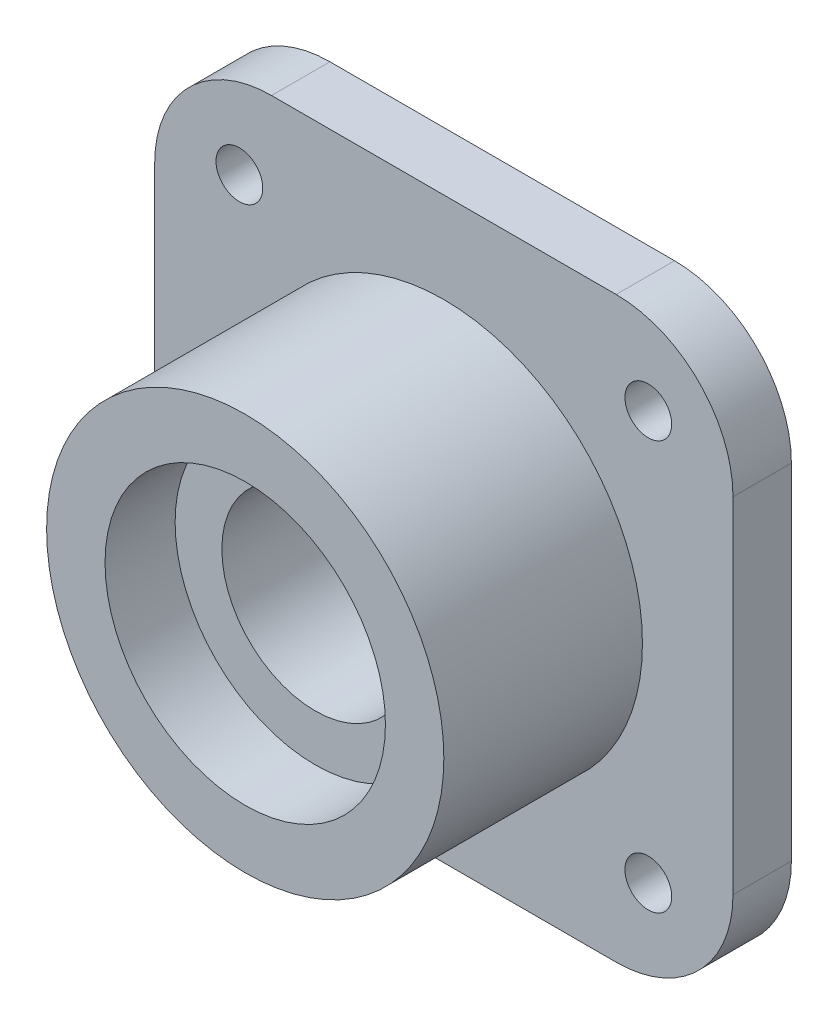
ISO-10303-21;
HEADER;
FILE_DESCRIPTION(('STEP AP214'),'2;1');
FILE_NAME('part.step','',(''),(''),'','','');
FILE_SCHEMA(('AUTOMOTIVE_DESIGN { 1 0 10303 214 1 1 1 1 }'));
ENDSEC;
DATA;
#1=APPLICATION_CONTEXT('core data for automotive mechanical design processes');
#2=APPLICATION_PROTOCOL_DEFINITION('international standard','automotive_design',2000,#1);
#3=PRODUCT_CONTEXT('',#1,'mechanical');
#4=PRODUCT('Part','Part','',(#3));
#5=PRODUCT_RELATED_PRODUCT_CATEGORY('part','',(#4));
#6=PRODUCT_DEFINITION_FORMATION('','',#4);
#7=PRODUCT_DEFINITION_CONTEXT('part definition',#1,'design');
#8=PRODUCT_DEFINITION('design','',#6,#7);
#9=PRODUCT_DEFINITION_SHAPE('','',#8);
#10=(LENGTH_UNIT() NAMED_UNIT(*) SI_UNIT(.MILLI.,.METRE.));
#11=(NAMED_UNIT(*) PLANE_ANGLE_UNIT() SI_UNIT($,.RADIAN.));
#12=(NAMED_UNIT(*) SI_UNIT($,.STERADIAN.) SOLID_ANGLE_UNIT());
#13=UNCERTAINTY_MEASURE_WITH_UNIT(LENGTH_MEASURE(1.E-05),#10,'distance_accuracy_value','');
#14=(GEOMETRIC_REPRESENTATION_CONTEXT(3) GLOBAL_UNCERTAINTY_ASSIGNED_CONTEXT((#13)) GLOBAL_UNIT_ASSIGNED_CONTEXT((#10,
#11,#12)) REPRESENTATION_CONTEXT('',''));
#15=CARTESIAN_POINT('',(0.,0.,0.));
#16=DIRECTION('',(0.,0.,1.));
#17=DIRECTION('',(1.,0.,0.));
#18=AXIS2_PLACEMENT_3D('',#15,#16,#17);
#19=CARTESIAN_POINT('',(0.,12.,-22.));
#20=DIRECTION('',(0.,0.,1.));
#21=DIRECTION('',(1.,0.,0.));
#22=AXIS2_PLACEMENT_3D('',#19,#20,#21);
#23=PLANE('',#22);
#24=CARTESIAN_POINT('',(17.5,-17.5,-22.));
#25=DIRECTION('',(0.,0.,-1.));
#26=DIRECTION('',(-1.,0.,0.));
#27=AXIS2_PLACEMENT_3D('',#24,#25,#26);
#28=CIRCLE('',#27,2.);
#29=CARTESIAN_POINT('',(15.5,-17.5,-22.));
#30=VERTEX_POINT('',#29);
#31=EDGE_CURVE('E323',#30,#30,#28,.T.);
#32=ORIENTED_EDGE('',*,*,#31,.F.);
#33=EDGE_LOOP('',(#32));
#34=FACE_BOUND('',#33,.T.);
#35=CARTESIAN_POINT('',(-17.5,-17.5,-22.));
#36=DIRECTION('',(0.,0.,-1.));
#37=DIRECTION('',(-1.,0.,0.));
#38=AXIS2_PLACEMENT_3D('',#35,#36,#37);
#39=CIRCLE('',#38,2.);
#40=CARTESIAN_POINT('',(-19.5,-17.5,-22.));
#41=VERTEX_POINT('',#40);
#42=EDGE_CURVE('E319',#41,#41,#39,.T.);
#43=ORIENTED_EDGE('',*,*,#42,.F.);
#44=EDGE_LOOP('',(#43));
#45=FACE_BOUND('',#44,.T.);
#46=CARTESIAN_POINT('',(-17.5,17.5,-22.));
#47=DIRECTION('',(0.,0.,-1.));
#48=DIRECTION('',(-1.,0.,0.));
#49=AXIS2_PLACEMENT_3D('',#46,#47,#48);
#50=CIRCLE('',#49,2.);
#51=CARTESIAN_POINT('',(-19.5,17.5,-22.));
#52=VERTEX_POINT('',#51);
#53=EDGE_CURVE('E312',#52,#52,#50,.T.);
#54=ORIENTED_EDGE('',*,*,#53,.F.);
#55=EDGE_LOOP('',(#54));
#56=FACE_BOUND('',#55,.T.);
#57=CARTESIAN_POINT('',(17.5,17.5,-22.));
#58=DIRECTION('',(0.,0.,-1.));
#59=DIRECTION('',(-1.,0.,0.));
#60=AXIS2_PLACEMENT_3D('',#57,#58,#59);
#61=CIRCLE('',#60,2.);
#62=CARTESIAN_POINT('',(15.5,17.5,-22.));
#63=VERTEX_POINT('',#62);
#64=EDGE_CURVE('E193',#63,#63,#61,.T.);
#65=ORIENTED_EDGE('',*,*,#64,.F.);
#66=EDGE_LOOP('',(#65));
#67=FACE_BOUND('',#66,.T.);
#68=CARTESIAN_POINT('',(0.,0.,-22.));
#69=DIRECTION('',(0.,0.,1.));
#70=DIRECTION('',(1.,0.,0.));
#71=AXIS2_PLACEMENT_3D('',#68,#69,#70);
#72=CIRCLE('',#71,12.);
#73=CARTESIAN_POINT('',(12.,0.,-22.));
#74=VERTEX_POINT('',#73);
#75=EDGE_CURVE('E150',#74,#74,#72,.T.);
#76=ORIENTED_EDGE('',*,*,#75,.T.);
#77=EDGE_LOOP('',(#76));
#78=FACE_BOUND('',#77,.T.);
#79=DIRECTION('',(1.,0.,0.));
#80=VECTOR('',#79,1.);
#81=CARTESIAN_POINT('',(0.,24.7487373415292,-22.));
#82=LINE('',#81,#80);
#83=CARTESIAN_POINT('',(-14.7487373415292,24.7487373415292,-22.));
#84=VERTEX_POINT('',#83);
#85=CARTESIAN_POINT('',(14.7487373415292,24.7487373415292,-22.));
#86=VERTEX_POINT('',#85);
#87=EDGE_CURVE('E138',#84,#86,#82,.T.);
#88=ORIENTED_EDGE('',*,*,#87,.T.);
#89=CARTESIAN_POINT('',(14.7487373415292,14.7487373415292,-22.));
#90=DIRECTION('',(0.,0.,1.));
#91=DIRECTION('',(1.,0.,0.));
#92=AXIS2_PLACEMENT_3D('',#89,#90,#91);
#93=CIRCLE('',#92,10.);
#94=CARTESIAN_POINT('',(24.7487373415292,14.7487373415292,-22.));
#95=VERTEX_POINT('',#94);
#96=EDGE_CURVE('E181',#86,#95,#93,.F.);
#97=ORIENTED_EDGE('',*,*,#96,.T.);
#98=DIRECTION('',(0.,-1.,0.));
#99=VECTOR('',#98,1.);
#100=CARTESIAN_POINT('',(24.7487373415292,12.,-22.));
#101=LINE('',#100,#99);
#102=CARTESIAN_POINT('',(24.7487373415292,-14.7487373415292,-22.));
#103=VERTEX_POINT('',#102);
#104=EDGE_CURVE('E127',#95,#103,#101,.T.);
#105=ORIENTED_EDGE('',*,*,#104,.T.);
#106=CARTESIAN_POINT('',(14.7487373415292,-14.7487373415292,-22.));
#107=DIRECTION('',(0.,0.,1.));
#108=DIRECTION('',(1.,0.,0.));
#109=AXIS2_PLACEMENT_3D('',#106,#107,#108);
#110=CIRCLE('',#109,10.);
#111=CARTESIAN_POINT('',(14.7487373415292,-24.7487373415292,-22.));
#112=VERTEX_POINT('',#111);
#113=EDGE_CURVE('E179',#103,#112,#110,.F.);
#114=ORIENTED_EDGE('',*,*,#113,.T.);
#115=DIRECTION('',(1.,0.,0.));
#116=VECTOR('',#115,1.);
#117=CARTESIAN_POINT('',(0.,-24.7487373415292,-22.));
#118=LINE('',#117,#116);
#119=CARTESIAN_POINT('',(-14.7487373415292,-24.7487373415292,-22.));
#120=VERTEX_POINT('',#119);
#121=EDGE_CURVE('E203',#120,#112,#118,.T.);
#122=ORIENTED_EDGE('',*,*,#121,.F.);
#123=CARTESIAN_POINT('',(-14.7487373415292,-14.7487373415292,-22.));
#124=DIRECTION('',(0.,0.,1.));
#125=DIRECTION('',(1.,0.,0.));
#126=AXIS2_PLACEMENT_3D('',#123,#124,#125);
#127=CIRCLE('',#126,10.);
#128=CARTESIAN_POINT('',(-24.7487373415292,-14.7487373415292,-22.));
#129=VERTEX_POINT('',#128);
#130=EDGE_CURVE('E56',#120,#129,#127,.F.);
#131=ORIENTED_EDGE('',*,*,#130,.T.);
#132=DIRECTION('',(0.,-1.,0.));
#133=VECTOR('',#132,1.);
#134=CARTESIAN_POINT('',(-24.7487373415292,12.,-22.));
#135=LINE('',#134,#133);
#136=CARTESIAN_POINT('',(-24.7487373415292,14.7487373415292,-22.));
#137=VERTEX_POINT('',#136);
#138=EDGE_CURVE('E133',#137,#129,#135,.T.);
#139=ORIENTED_EDGE('',*,*,#138,.F.);
#140=CARTESIAN_POINT('',(-14.7487373415292,14.7487373415292,-22.));
#141=DIRECTION('',(0.,0.,1.));
#142=DIRECTION('',(1.,0.,0.));
#143=AXIS2_PLACEMENT_3D('',#140,#141,#142);
#144=CIRCLE('',#143,10.);
#145=EDGE_CURVE('E176',#137,#84,#144,.F.);
#146=ORIENTED_EDGE('',*,*,#145,.T.);
#147=EDGE_LOOP('',(#88,#97,#105,#114,#122,#131,#139,#146));
#148=FACE_BOUND('',#147,.T.);
#149=ADVANCED_FACE('F39',(#34,#45,#56,#67,#78,#148),#23,.F.);
#150=CARTESIAN_POINT('',(0.,35.,-17.));
#151=DIRECTION('',(0.,0.,-1.));
#152=DIRECTION('',(-1.,0.,0.));
#153=AXIS2_PLACEMENT_3D('',#150,#151,#152);
#154=PLANE('',#153);
#155=CARTESIAN_POINT('',(17.5,-17.5,-17.));
#156=DIRECTION('',(0.,0.,-1.));
#157=DIRECTION('',(-1.,0.,0.));
#158=AXIS2_PLACEMENT_3D('',#155,#156,#157);
#159=CIRCLE('',#158,2.);
#160=CARTESIAN_POINT('',(15.5,-17.5,-17.));
#161=VERTEX_POINT('',#160);
#162=EDGE_CURVE('E43',#161,#161,#159,.T.);
#163=ORIENTED_EDGE('',*,*,#162,.T.);
#164=EDGE_LOOP('',(#163));
#165=FACE_BOUND('',#164,.T.);
#166=CARTESIAN_POINT('',(-17.5,-17.5,-17.));
#167=DIRECTION('',(0.,0.,-1.));
#168=DIRECTION('',(-1.,0.,0.));
#169=AXIS2_PLACEMENT_3D('',#166,#167,#168);
#170=CIRCLE('',#169,2.);
#171=CARTESIAN_POINT('',(-19.5,-17.5,-17.));
#172=VERTEX_POINT('',#171);
#173=EDGE_CURVE('E195',#172,#172,#170,.T.);
#174=ORIENTED_EDGE('',*,*,#173,.T.);
#175=EDGE_LOOP('',(#174));
#176=FACE_BOUND('',#175,.T.);
#177=CARTESIAN_POINT('',(-17.5,17.5,-17.));
#178=DIRECTION('',(0.,0.,-1.));
#179=DIRECTION('',(-1.,0.,0.));
#180=AXIS2_PLACEMENT_3D('',#177,#178,#179);
#181=CIRCLE('',#180,2.);
#182=CARTESIAN_POINT('',(-19.5,17.5,-17.));
#183=VERTEX_POINT('',#182);
#184=EDGE_CURVE('E192',#183,#183,#181,.T.);
#185=ORIENTED_EDGE('',*,*,#184,.T.);
#186=EDGE_LOOP('',(#185));
#187=FACE_BOUND('',#186,.T.);
#188=CARTESIAN_POINT('',(17.5,17.5,-17.));
#189=DIRECTION('',(0.,0.,-1.));
#190=DIRECTION('',(-1.,0.,0.));
#191=AXIS2_PLACEMENT_3D('',#188,#189,#190);
#192=CIRCLE('',#191,2.);
#193=CARTESIAN_POINT('',(15.5,17.5,-17.));
#194=VERTEX_POINT('',#193);
#195=EDGE_CURVE('E189',#194,#194,#192,.T.);
#196=ORIENTED_EDGE('',*,*,#195,.T.);
#197=EDGE_LOOP('',(#196));
#198=FACE_BOUND('',#197,.T.);
#199=CARTESIAN_POINT('',(0.,0.,-17.));
#200=DIRECTION('',(0.,0.,1.));
#201=DIRECTION('',(1.,0.,0.));
#202=AXIS2_PLACEMENT_3D('',#199,#200,#201);
#203=CIRCLE('',#202,17.);
#204=CARTESIAN_POINT('',(17.,0.,-17.));
#205=VERTEX_POINT('',#204);
#206=EDGE_CURVE('E147',#205,#205,#203,.T.);
#207=ORIENTED_EDGE('',*,*,#206,.F.);
#208=EDGE_LOOP('',(#207));
#209=FACE_BOUND('',#208,.T.);
#210=DIRECTION('',(0.,-1.,0.));
#211=VECTOR('',#210,1.);
#212=CARTESIAN_POINT('',(24.7487373415292,0.,-17.));
#213=LINE('',#212,#211);
#214=CARTESIAN_POINT('',(24.7487373415292,14.7487373415292,-17.));
#215=VERTEX_POINT('',#214);
#216=CARTESIAN_POINT('',(24.7487373415292,-14.7487373415292,-17.));
#217=VERTEX_POINT('',#216);
#218=EDGE_CURVE('E124',#215,#217,#213,.T.);
#219=ORIENTED_EDGE('',*,*,#218,.F.);
#220=CARTESIAN_POINT('',(14.7487373415292,14.7487373415292,-17.));
#221=DIRECTION('',(0.,0.,-1.));
#222=DIRECTION('',(-1.,0.,0.));
#223=AXIS2_PLACEMENT_3D('',#220,#221,#222);
#224=CIRCLE('',#223,10.);
#225=CARTESIAN_POINT('',(14.7487373415292,24.7487373415292,-17.));
#226=VERTEX_POINT('',#225);
#227=EDGE_CURVE('E107',#215,#226,#224,.F.);
#228=ORIENTED_EDGE('',*,*,#227,.T.);
#229=DIRECTION('',(1.,0.,0.));
#230=VECTOR('',#229,1.);
#231=CARTESIAN_POINT('',(0.,24.7487373415292,-17.));
#232=LINE('',#231,#230);
#233=CARTESIAN_POINT('',(-14.7487373415292,24.7487373415292,-17.));
#234=VERTEX_POINT('',#233);
#235=EDGE_CURVE('E207',#234,#226,#232,.T.);
#236=ORIENTED_EDGE('',*,*,#235,.F.);
#237=CARTESIAN_POINT('',(-14.7487373415292,14.7487373415292,-17.));
#238=DIRECTION('',(0.,0.,-1.));
#239=DIRECTION('',(-1.,0.,0.));
#240=AXIS2_PLACEMENT_3D('',#237,#238,#239);
#241=CIRCLE('',#240,10.);
#242=CARTESIAN_POINT('',(-24.7487373415292,14.7487373415292,-17.));
#243=VERTEX_POINT('',#242);
#244=EDGE_CURVE('E128',#234,#243,#241,.F.);
#245=ORIENTED_EDGE('',*,*,#244,.T.);
#246=DIRECTION('',(0.,-1.,0.));
#247=VECTOR('',#246,1.);
#248=CARTESIAN_POINT('',(-24.7487373415292,0.,-17.));
#249=LINE('',#248,#247);
#250=CARTESIAN_POINT('',(-24.7487373415292,-14.7487373415292,-17.));
#251=VERTEX_POINT('',#250);
#252=EDGE_CURVE('E134',#243,#251,#249,.T.);
#253=ORIENTED_EDGE('',*,*,#252,.T.);
#254=CARTESIAN_POINT('',(-14.7487373415292,-14.7487373415292,-17.));
#255=DIRECTION('',(0.,0.,-1.));
#256=DIRECTION('',(-1.,0.,0.));
#257=AXIS2_PLACEMENT_3D('',#254,#255,#256);
#258=CIRCLE('',#257,10.);
#259=CARTESIAN_POINT('',(-14.7487373415292,-24.7487373415292,-17.));
#260=VERTEX_POINT('',#259);
#261=EDGE_CURVE('E170',#251,#260,#258,.F.);
#262=ORIENTED_EDGE('',*,*,#261,.T.);
#263=DIRECTION('',(1.,0.,0.));
#264=VECTOR('',#263,1.);
#265=CARTESIAN_POINT('',(0.,-24.7487373415292,-17.));
#266=LINE('',#265,#264);
#267=CARTESIAN_POINT('',(14.7487373415292,-24.7487373415292,-17.));
#268=VERTEX_POINT('',#267);
#269=EDGE_CURVE('E200',#260,#268,#266,.T.);
#270=ORIENTED_EDGE('',*,*,#269,.T.);
#271=CARTESIAN_POINT('',(14.7487373415292,-14.7487373415292,-17.));
#272=DIRECTION('',(0.,0.,-1.));
#273=DIRECTION('',(-1.,0.,0.));
#274=AXIS2_PLACEMENT_3D('',#271,#272,#273);
#275=CIRCLE('',#274,10.);
#276=EDGE_CURVE('E118',#268,#217,#275,.F.);
#277=ORIENTED_EDGE('',*,*,#276,.T.);
#278=EDGE_LOOP('',(#219,#228,#236,#245,#253,#262,#270,#277));
#279=FACE_BOUND('',#278,.T.);
#280=ADVANCED_FACE('F131',(#165,#176,#187,#198,#209,#279),#154,.F.);
#281=CARTESIAN_POINT('',(0.,17.,0.));
#282=DIRECTION('',(0.,0.,-1.));
#283=DIRECTION('',(-1.,0.,0.));
#284=AXIS2_PLACEMENT_3D('',#281,#282,#283);
#285=PLANE('',#284);
#286=CARTESIAN_POINT('',(0.,0.,0.));
#287=DIRECTION('',(0.,0.,1.));
#288=DIRECTION('',(1.,0.,0.));
#289=AXIS2_PLACEMENT_3D('',#286,#287,#288);
#290=CIRCLE('',#289,12.);
#291=CARTESIAN_POINT('',(12.,0.,0.));
#292=VERTEX_POINT('',#291);
#293=EDGE_CURVE('E165',#292,#292,#290,.T.);
#294=ORIENTED_EDGE('',*,*,#293,.F.);
#295=EDGE_LOOP('',(#294));
#296=FACE_BOUND('',#295,.T.);
#297=CARTESIAN_POINT('',(0.,0.,0.));
#298=DIRECTION('',(0.,0.,1.));
#299=DIRECTION('',(1.,0.,0.));
#300=AXIS2_PLACEMENT_3D('',#297,#298,#299);
#301=CIRCLE('',#300,17.);
#302=CARTESIAN_POINT('',(17.,0.,0.));
#303=VERTEX_POINT('',#302);
#304=EDGE_CURVE('E144',#303,#303,#301,.T.);
#305=ORIENTED_EDGE('',*,*,#304,.T.);
#306=EDGE_LOOP('',(#305));
#307=FACE_BOUND('',#306,.T.);
#308=ADVANCED_FACE('F242',(#296,#307),#285,.F.);
#309=CARTESIAN_POINT('',(0.,0.,0.));
#310=DIRECTION('',(0.,0.,1.));
#311=DIRECTION('',(1.,0.,0.));
#312=AXIS2_PLACEMENT_3D('',#309,#310,#311);
#313=CYLINDRICAL_SURFACE('',#312,12.);
#314=CARTESIAN_POINT('',(0.,0.,-6.));
#315=DIRECTION('',(0.,0.,1.));
#316=DIRECTION('',(1.,0.,0.));
#317=AXIS2_PLACEMENT_3D('',#314,#315,#316);
#318=CIRCLE('',#317,12.);
#319=CARTESIAN_POINT('',(12.,0.,-6.));
#320=VERTEX_POINT('',#319);
#321=EDGE_CURVE('E162',#320,#320,#318,.T.);
#322=ORIENTED_EDGE('',*,*,#321,.F.);
#323=EDGE_LOOP('',(#322));
#324=FACE_BOUND('',#323,.T.);
#325=ORIENTED_EDGE('',*,*,#293,.T.);
#326=EDGE_LOOP('',(#325));
#327=FACE_BOUND('',#326,.T.);
#328=ADVANCED_FACE('F264',(#324,#327),#313,.F.);
#329=CARTESIAN_POINT('',(0.,12.,-6.));
#330=DIRECTION('',(0.,0.,-1.));
#331=DIRECTION('',(-1.,0.,0.));
#332=AXIS2_PLACEMENT_3D('',#329,#330,#331);
#333=PLANE('',#332);
#334=CARTESIAN_POINT('',(0.,0.,-6.));
#335=DIRECTION('',(0.,0.,1.));
#336=DIRECTION('',(1.,0.,0.));
#337=AXIS2_PLACEMENT_3D('',#334,#335,#336);
#338=CIRCLE('',#337,8.);
#339=CARTESIAN_POINT('',(8.,0.,-6.));
#340=VERTEX_POINT('',#339);
#341=EDGE_CURVE('E159',#340,#340,#338,.T.);
#342=ORIENTED_EDGE('',*,*,#341,.F.);
#343=EDGE_LOOP('',(#342));
#344=FACE_BOUND('',#343,.T.);
#345=ORIENTED_EDGE('',*,*,#321,.T.);
#346=EDGE_LOOP('',(#345));
#347=FACE_BOUND('',#346,.T.);
#348=ADVANCED_FACE('F260',(#344,#347),#333,.F.);
#349=CARTESIAN_POINT('',(0.,0.,0.));
#350=DIRECTION('',(0.,0.,1.));
#351=DIRECTION('',(1.,0.,0.));
#352=AXIS2_PLACEMENT_3D('',#349,#350,#351);
#353=CYLINDRICAL_SURFACE('',#352,8.);
#354=CARTESIAN_POINT('',(0.,0.,-16.));
#355=DIRECTION('',(0.,0.,1.));
#356=DIRECTION('',(1.,0.,0.));
#357=AXIS2_PLACEMENT_3D('',#354,#355,#356);
#358=CIRCLE('',#357,8.);
#359=CARTESIAN_POINT('',(8.,0.,-16.));
#360=VERTEX_POINT('',#359);
#361=EDGE_CURVE('E156',#360,#360,#358,.T.);
#362=ORIENTED_EDGE('',*,*,#361,.F.);
#363=EDGE_LOOP('',(#362));
#364=FACE_BOUND('',#363,.T.);
#365=ORIENTED_EDGE('',*,*,#341,.T.);
#366=EDGE_LOOP('',(#365));
#367=FACE_BOUND('',#366,.T.);
#368=ADVANCED_FACE('F256',(#364,#367),#353,.F.);
#369=CARTESIAN_POINT('',(0.,8.,-16.));
#370=DIRECTION('',(0.,0.,1.));
#371=DIRECTION('',(1.,0.,0.));
#372=AXIS2_PLACEMENT_3D('',#369,#370,#371);
#373=PLANE('',#372);
#374=CARTESIAN_POINT('',(0.,0.,-16.));
#375=DIRECTION('',(0.,0.,1.));
#376=DIRECTION('',(1.,0.,0.));
#377=AXIS2_PLACEMENT_3D('',#374,#375,#376);
#378=CIRCLE('',#377,12.);
#379=CARTESIAN_POINT('',(12.,0.,-16.));
#380=VERTEX_POINT('',#379);
#381=EDGE_CURVE('E153',#380,#380,#378,.T.);
#382=ORIENTED_EDGE('',*,*,#381,.F.);
#383=EDGE_LOOP('',(#382));
#384=FACE_BOUND('',#383,.T.);
#385=ORIENTED_EDGE('',*,*,#361,.T.);
#386=EDGE_LOOP('',(#385));
#387=FACE_BOUND('',#386,.T.);
#388=ADVANCED_FACE('F252',(#384,#387),#373,.F.);
#389=CARTESIAN_POINT('',(0.,0.,0.));
#390=DIRECTION('',(0.,0.,1.));
#391=DIRECTION('',(1.,0.,0.));
#392=AXIS2_PLACEMENT_3D('',#389,#390,#391);
#393=CYLINDRICAL_SURFACE('',#392,12.);
#394=ORIENTED_EDGE('',*,*,#75,.F.);
#395=EDGE_LOOP('',(#394));
#396=FACE_BOUND('',#395,.T.);
#397=ORIENTED_EDGE('',*,*,#381,.T.);
#398=EDGE_LOOP('',(#397));
#399=FACE_BOUND('',#398,.T.);
#400=ADVANCED_FACE('F248',(#396,#399),#393,.F.);
#401=CARTESIAN_POINT('',(0.,0.,0.));
#402=DIRECTION('',(0.,0.,1.));
#403=DIRECTION('',(1.,0.,0.));
#404=AXIS2_PLACEMENT_3D('',#401,#402,#403);
#405=CYLINDRICAL_SURFACE('',#404,17.);
#406=ORIENTED_EDGE('',*,*,#304,.F.);
#407=EDGE_LOOP('',(#406));
#408=FACE_BOUND('',#407,.T.);
#409=ORIENTED_EDGE('',*,*,#206,.T.);
#410=EDGE_LOOP('',(#409));
#411=FACE_BOUND('',#410,.T.);
#412=ADVANCED_FACE('F251',(#408,#411),#405,.T.);
#413=CARTESIAN_POINT('',(-24.7487373415292,0.,-27.));
#414=DIRECTION('',(-1.,0.,0.));
#415=DIRECTION('',(0.,0.,1.));
#416=AXIS2_PLACEMENT_3D('',#413,#414,#415);
#417=PLANE('',#416);
#418=ORIENTED_EDGE('',*,*,#138,.T.);
#419=DIRECTION('',(0.,0.,1.));
#420=VECTOR('',#419,1.);
#421=CARTESIAN_POINT('',(-24.7487373415292,-14.7487373415292,-27.));
#422=LINE('',#421,#420);
#423=EDGE_CURVE('E11',#129,#251,#422,.T.);
#424=ORIENTED_EDGE('',*,*,#423,.T.);
#425=ORIENTED_EDGE('',*,*,#252,.F.);
#426=DIRECTION('',(0.,0.,1.));
#427=VECTOR('',#426,1.);
#428=CARTESIAN_POINT('',(-24.7487373415292,14.7487373415292,-22.));
#429=LINE('',#428,#427);
#430=EDGE_CURVE('E48',#243,#137,#429,.F.);
#431=ORIENTED_EDGE('',*,*,#430,.T.);
#432=EDGE_LOOP('',(#418,#424,#425,#431));
#433=FACE_BOUND('',#432,.T.);
#434=ADVANCED_FACE('F218',(#433),#417,.T.);
#435=CARTESIAN_POINT('',(24.7487373415292,0.,-27.));
#436=DIRECTION('',(-1.,0.,0.));
#437=DIRECTION('',(0.,0.,1.));
#438=AXIS2_PLACEMENT_3D('',#435,#436,#437);
#439=PLANE('',#438);
#440=ORIENTED_EDGE('',*,*,#104,.F.);
#441=DIRECTION('',(0.,0.,1.));
#442=VECTOR('',#441,1.);
#443=CARTESIAN_POINT('',(24.7487373415292,14.7487373415292,-27.));
#444=LINE('',#443,#442);
#445=EDGE_CURVE('E111',#95,#215,#444,.T.);
#446=ORIENTED_EDGE('',*,*,#445,.T.);
#447=ORIENTED_EDGE('',*,*,#218,.T.);
#448=DIRECTION('',(0.,0.,1.));
#449=VECTOR('',#448,1.);
#450=CARTESIAN_POINT('',(24.7487373415292,-14.7487373415292,-22.));
#451=LINE('',#450,#449);
#452=EDGE_CURVE('E129',#217,#103,#451,.F.);
#453=ORIENTED_EDGE('',*,*,#452,.T.);
#454=EDGE_LOOP('',(#440,#446,#447,#453));
#455=FACE_BOUND('',#454,.T.);
#456=ADVANCED_FACE('F123',(#455),#439,.F.);
#457=CARTESIAN_POINT('',(0.,24.7487373415292,-27.));
#458=DIRECTION('',(0.,-1.,0.));
#459=DIRECTION('',(0.,0.,-1.));
#460=AXIS2_PLACEMENT_3D('',#457,#458,#459);
#461=PLANE('',#460);
#462=ORIENTED_EDGE('',*,*,#235,.T.);
#463=DIRECTION('',(0.,0.,1.));
#464=VECTOR('',#463,1.);
#465=CARTESIAN_POINT('',(14.7487373415292,24.7487373415292,-27.));
#466=LINE('',#465,#464);
#467=EDGE_CURVE('E112',#226,#86,#466,.F.);
#468=ORIENTED_EDGE('',*,*,#467,.T.);
#469=ORIENTED_EDGE('',*,*,#87,.F.);
#470=DIRECTION('',(0.,0.,1.));
#471=VECTOR('',#470,1.);
#472=CARTESIAN_POINT('',(-14.7487373415292,24.7487373415292,-17.));
#473=LINE('',#472,#471);
#474=EDGE_CURVE('E117',#84,#234,#473,.T.);
#475=ORIENTED_EDGE('',*,*,#474,.T.);
#476=EDGE_LOOP('',(#462,#468,#469,#475));
#477=FACE_BOUND('',#476,.T.);
#478=ADVANCED_FACE('F216',(#477),#461,.F.);
#479=CARTESIAN_POINT('',(0.,-24.7487373415292,-27.));
#480=DIRECTION('',(0.,-1.,0.));
#481=DIRECTION('',(1.,0.,0.));
#482=AXIS2_PLACEMENT_3D('',#479,#480,#481);
#483=PLANE('',#482);
#484=ORIENTED_EDGE('',*,*,#121,.T.);
#485=DIRECTION('',(0.,0.,1.));
#486=VECTOR('',#485,1.);
#487=CARTESIAN_POINT('',(14.7487373415292,-24.7487373415292,-17.));
#488=LINE('',#487,#486);
#489=EDGE_CURVE('E185',#112,#268,#488,.T.);
#490=ORIENTED_EDGE('',*,*,#489,.T.);
#491=ORIENTED_EDGE('',*,*,#269,.F.);
#492=DIRECTION('',(0.,0.,1.));
#493=VECTOR('',#492,1.);
#494=CARTESIAN_POINT('',(-14.7487373415292,-24.7487373415292,-27.));
#495=LINE('',#494,#493);
#496=EDGE_CURVE('E183',#260,#120,#495,.F.);
#497=ORIENTED_EDGE('',*,*,#496,.T.);
#498=EDGE_LOOP('',(#484,#490,#491,#497));
#499=FACE_BOUND('',#498,.T.);
#500=ADVANCED_FACE('F224',(#499),#483,.T.);
#501=CARTESIAN_POINT('',(14.7487373415292,14.7487373415292,-27.));
#502=DIRECTION('',(0.,0.,1.));
#503=DIRECTION('',(1.,0.,0.));
#504=AXIS2_PLACEMENT_3D('',#501,#502,#503);
#505=CYLINDRICAL_SURFACE('',#504,10.);
#506=ORIENTED_EDGE('',*,*,#96,.F.);
#507=ORIENTED_EDGE('',*,*,#467,.F.);
#508=ORIENTED_EDGE('',*,*,#227,.F.);
#509=ORIENTED_EDGE('',*,*,#445,.F.);
#510=EDGE_LOOP('',(#506,#507,#508,#509));
#511=FACE_BOUND('',#510,.T.);
#512=ADVANCED_FACE('F110',(#511),#505,.T.);
#513=CARTESIAN_POINT('',(14.7487373415292,-14.7487373415292,-27.));
#514=DIRECTION('',(0.,0.,-1.));
#515=DIRECTION('',(-1.,0.,0.));
#516=AXIS2_PLACEMENT_3D('',#513,#514,#515);
#517=CYLINDRICAL_SURFACE('',#516,10.);
#518=ORIENTED_EDGE('',*,*,#113,.F.);
#519=ORIENTED_EDGE('',*,*,#452,.F.);
#520=ORIENTED_EDGE('',*,*,#276,.F.);
#521=ORIENTED_EDGE('',*,*,#489,.F.);
#522=EDGE_LOOP('',(#518,#519,#520,#521));
#523=FACE_BOUND('',#522,.T.);
#524=ADVANCED_FACE('F228',(#523),#517,.T.);
#525=CARTESIAN_POINT('',(-14.7487373415292,-14.7487373415292,-27.));
#526=DIRECTION('',(0.,0.,1.));
#527=DIRECTION('',(1.,0.,0.));
#528=AXIS2_PLACEMENT_3D('',#525,#526,#527);
#529=CYLINDRICAL_SURFACE('',#528,10.);
#530=ORIENTED_EDGE('',*,*,#130,.F.);
#531=ORIENTED_EDGE('',*,*,#496,.F.);
#532=ORIENTED_EDGE('',*,*,#261,.F.);
#533=ORIENTED_EDGE('',*,*,#423,.F.);
#534=EDGE_LOOP('',(#530,#531,#532,#533));
#535=FACE_BOUND('',#534,.T.);
#536=ADVANCED_FACE('F221',(#535),#529,.T.);
#537=CARTESIAN_POINT('',(-14.7487373415292,14.7487373415292,-27.));
#538=DIRECTION('',(0.,0.,-1.));
#539=DIRECTION('',(-1.,0.,0.));
#540=AXIS2_PLACEMENT_3D('',#537,#538,#539);
#541=CYLINDRICAL_SURFACE('',#540,10.);
#542=ORIENTED_EDGE('',*,*,#145,.F.);
#543=ORIENTED_EDGE('',*,*,#430,.F.);
#544=ORIENTED_EDGE('',*,*,#244,.F.);
#545=ORIENTED_EDGE('',*,*,#474,.F.);
#546=EDGE_LOOP('',(#542,#543,#544,#545));
#547=FACE_BOUND('',#546,.T.);
#548=ADVANCED_FACE('F41',(#547),#541,.T.);
#549=CARTESIAN_POINT('',(17.5,17.5,-12.));
#550=DIRECTION('',(0.,0.,-1.));
#551=DIRECTION('',(-1.,0.,0.));
#552=AXIS2_PLACEMENT_3D('',#549,#550,#551);
#553=CYLINDRICAL_SURFACE('',#552,2.);
#554=ORIENTED_EDGE('',*,*,#64,.T.);
#555=EDGE_LOOP('',(#554));
#556=FACE_BOUND('',#555,.T.);
#557=ORIENTED_EDGE('',*,*,#195,.F.);
#558=EDGE_LOOP('',(#557));
#559=FACE_BOUND('',#558,.T.);
#560=ADVANCED_FACE('F292',(#556,#559),#553,.F.);
#561=CARTESIAN_POINT('',(-17.5,17.5,-12.));
#562=DIRECTION('',(0.,0.,-1.));
#563=DIRECTION('',(-1.,0.,0.));
#564=AXIS2_PLACEMENT_3D('',#561,#562,#563);
#565=CYLINDRICAL_SURFACE('',#564,2.);
#566=ORIENTED_EDGE('',*,*,#53,.T.);
#567=EDGE_LOOP('',(#566));
#568=FACE_BOUND('',#567,.T.);
#569=ORIENTED_EDGE('',*,*,#184,.F.);
#570=EDGE_LOOP('',(#569));
#571=FACE_BOUND('',#570,.T.);
#572=ADVANCED_FACE('F295',(#568,#571),#565,.F.);
#573=CARTESIAN_POINT('',(-17.5,-17.5,-12.));
#574=DIRECTION('',(0.,0.,-1.));
#575=DIRECTION('',(-1.,0.,0.));
#576=AXIS2_PLACEMENT_3D('',#573,#574,#575);
#577=CYLINDRICAL_SURFACE('',#576,2.);
#578=ORIENTED_EDGE('',*,*,#42,.T.);
#579=EDGE_LOOP('',(#578));
#580=FACE_BOUND('',#579,.T.);
#581=ORIENTED_EDGE('',*,*,#173,.F.);
#582=EDGE_LOOP('',(#581));
#583=FACE_BOUND('',#582,.T.);
#584=ADVANCED_FACE('F300',(#580,#583),#577,.F.);
#585=CARTESIAN_POINT('',(17.5,-17.5,-12.));
#586=DIRECTION('',(0.,0.,-1.));
#587=DIRECTION('',(-1.,0.,0.));
#588=AXIS2_PLACEMENT_3D('',#585,#586,#587);
#589=CYLINDRICAL_SURFACE('',#588,2.);
#590=ORIENTED_EDGE('',*,*,#31,.T.);
#591=EDGE_LOOP('',(#590));
#592=FACE_BOUND('',#591,.T.);
#593=ORIENTED_EDGE('',*,*,#162,.F.);
#594=EDGE_LOOP('',(#593));
#595=FACE_BOUND('',#594,.T.);
#596=ADVANCED_FACE('F297',(#592,#595),#589,.F.);
#597=CLOSED_SHELL('',(#149,#280,#308,#328,#348,#368,#388,#400,#412,#434,#456,#478,#500,#512,
#524,#536,#548,#560,#572,#584,#596));
#598=MANIFOLD_SOLID_BREP('B2',#597);
#599=ADVANCED_BREP_SHAPE_REPRESENTATION('',(#18,#598),#14);
#600=SHAPE_DEFINITION_REPRESENTATION(#9,#599);
ENDSEC;
END-ISO-10303-21;
